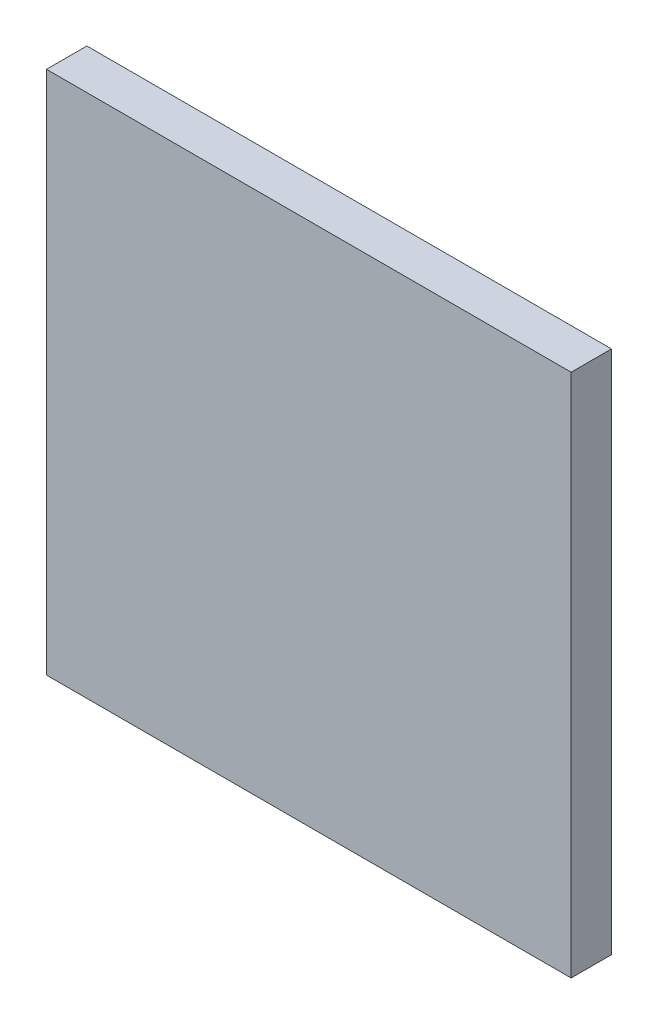
ISO-10303-21;
HEADER;
FILE_DESCRIPTION(('STEP AP214'),'2;1');
FILE_NAME('part.step','',(''),(''),'','','');
FILE_SCHEMA(('AUTOMOTIVE_DESIGN { 1 0 10303 214 1 1 1 1 }'));
ENDSEC;
DATA;
#1=APPLICATION_CONTEXT('core data for automotive mechanical design processes');
#2=APPLICATION_PROTOCOL_DEFINITION('international standard','automotive_design',2000,#1);
#3=PRODUCT_CONTEXT('',#1,'mechanical');
#4=PRODUCT('Part','Part','',(#3));
#5=PRODUCT_RELATED_PRODUCT_CATEGORY('part','',(#4));
#6=PRODUCT_DEFINITION_FORMATION('','',#4);
#7=PRODUCT_DEFINITION_CONTEXT('part definition',#1,'design');
#8=PRODUCT_DEFINITION('design','',#6,#7);
#9=PRODUCT_DEFINITION_SHAPE('','',#8);
#10=(LENGTH_UNIT() NAMED_UNIT(*) SI_UNIT(.MILLI.,.METRE.));
#11=(NAMED_UNIT(*) PLANE_ANGLE_UNIT() SI_UNIT($,.RADIAN.));
#12=(NAMED_UNIT(*) SI_UNIT($,.STERADIAN.) SOLID_ANGLE_UNIT());
#13=UNCERTAINTY_MEASURE_WITH_UNIT(LENGTH_MEASURE(1.E-05),#10,'distance_accuracy_value','');
#14=(GEOMETRIC_REPRESENTATION_CONTEXT(3) GLOBAL_UNCERTAINTY_ASSIGNED_CONTEXT((#13)) GLOBAL_UNIT_ASSIGNED_CONTEXT((#10,
#11,#12)) REPRESENTATION_CONTEXT('',''));
#15=CARTESIAN_POINT('',(0.,0.,0.));
#16=DIRECTION('',(0.,0.,1.));
#17=DIRECTION('',(1.,0.,0.));
#18=AXIS2_PLACEMENT_3D('',#15,#16,#17);
#19=CARTESIAN_POINT('',(32.5,-32.5,5.));
#20=DIRECTION('',(-1.,0.,0.));
#21=DIRECTION('',(0.,0.,1.));
#22=AXIS2_PLACEMENT_3D('',#19,#20,#21);
#23=PLANE('',#22);
#24=DIRECTION('',(0.,1.,0.));
#25=VECTOR('',#24,1.);
#26=CARTESIAN_POINT('',(32.5,-32.5,0.));
#27=LINE('',#26,#25);
#28=CARTESIAN_POINT('',(32.5,-32.5,0.));
#29=VERTEX_POINT('',#28);
#30=CARTESIAN_POINT('',(32.5,32.5,0.));
#31=VERTEX_POINT('',#30);
#32=EDGE_CURVE('E105',#29,#31,#27,.T.);
#33=ORIENTED_EDGE('',*,*,#32,.T.);
#34=DIRECTION('',(0.,0.,-1.));
#35=VECTOR('',#34,1.);
#36=CARTESIAN_POINT('',(32.5,32.5,5.));
#37=LINE('',#36,#35);
#38=CARTESIAN_POINT('',(32.5,32.5,5.));
#39=VERTEX_POINT('',#38);
#40=EDGE_CURVE('E11',#39,#31,#37,.T.);
#41=ORIENTED_EDGE('',*,*,#40,.F.);
#42=DIRECTION('',(0.,1.,0.));
#43=VECTOR('',#42,1.);
#44=CARTESIAN_POINT('',(32.5,-32.5,5.));
#45=LINE('',#44,#43);
#46=CARTESIAN_POINT('',(32.5,-32.5,5.));
#47=VERTEX_POINT('',#46);
#48=EDGE_CURVE('E89',#47,#39,#45,.T.);
#49=ORIENTED_EDGE('',*,*,#48,.F.);
#50=DIRECTION('',(0.,0.,-1.));
#51=VECTOR('',#50,1.);
#52=CARTESIAN_POINT('',(32.5,-32.5,5.));
#53=LINE('',#52,#51);
#54=EDGE_CURVE('E98',#47,#29,#53,.T.);
#55=ORIENTED_EDGE('',*,*,#54,.T.);
#56=EDGE_LOOP('',(#33,#41,#49,#55));
#57=FACE_BOUND('',#56,.T.);
#58=ADVANCED_FACE('F39',(#57),#23,.F.);
#59=CARTESIAN_POINT('',(-32.5,32.5,5.));
#60=DIRECTION('',(0.,-1.,0.));
#61=DIRECTION('',(0.,0.,-1.));
#62=AXIS2_PLACEMENT_3D('',#59,#60,#61);
#63=PLANE('',#62);
#64=DIRECTION('',(-1.,0.,0.));
#65=VECTOR('',#64,1.);
#66=CARTESIAN_POINT('',(-32.5,32.5,0.));
#67=LINE('',#66,#65);
#68=CARTESIAN_POINT('',(-32.5,32.5,0.));
#69=VERTEX_POINT('',#68);
#70=EDGE_CURVE('E94',#31,#69,#67,.T.);
#71=ORIENTED_EDGE('',*,*,#70,.T.);
#72=DIRECTION('',(0.,0.,-1.));
#73=VECTOR('',#72,1.);
#74=CARTESIAN_POINT('',(-32.5,32.5,5.));
#75=LINE('',#74,#73);
#76=CARTESIAN_POINT('',(-32.5,32.5,5.));
#77=VERTEX_POINT('',#76);
#78=EDGE_CURVE('E50',#77,#69,#75,.T.);
#79=ORIENTED_EDGE('',*,*,#78,.F.);
#80=DIRECTION('',(-1.,0.,0.));
#81=VECTOR('',#80,1.);
#82=CARTESIAN_POINT('',(-32.5,32.5,5.));
#83=LINE('',#82,#81);
#84=EDGE_CURVE('E81',#39,#77,#83,.T.);
#85=ORIENTED_EDGE('',*,*,#84,.F.);
#86=ORIENTED_EDGE('',*,*,#40,.T.);
#87=EDGE_LOOP('',(#71,#79,#85,#86));
#88=FACE_BOUND('',#87,.T.);
#89=ADVANCED_FACE('F91',(#88),#63,.F.);
#90=CARTESIAN_POINT('',(-32.5,-32.5,5.));
#91=DIRECTION('',(1.,0.,0.));
#92=DIRECTION('',(0.,0.,-1.));
#93=AXIS2_PLACEMENT_3D('',#90,#91,#92);
#94=PLANE('',#93);
#95=DIRECTION('',(0.,-1.,0.));
#96=VECTOR('',#95,1.);
#97=CARTESIAN_POINT('',(-32.5,-32.5,0.));
#98=LINE('',#97,#96);
#99=CARTESIAN_POINT('',(-32.5,-32.5,0.));
#100=VERTEX_POINT('',#99);
#101=EDGE_CURVE('E75',#69,#100,#98,.T.);
#102=ORIENTED_EDGE('',*,*,#101,.T.);
#103=DIRECTION('',(0.,0.,-1.));
#104=VECTOR('',#103,1.);
#105=CARTESIAN_POINT('',(-32.5,-32.5,5.));
#106=LINE('',#105,#104);
#107=CARTESIAN_POINT('',(-32.5,-32.5,5.));
#108=VERTEX_POINT('',#107);
#109=EDGE_CURVE('E92',#108,#100,#106,.T.);
#110=ORIENTED_EDGE('',*,*,#109,.F.);
#111=DIRECTION('',(0.,-1.,0.));
#112=VECTOR('',#111,1.);
#113=CARTESIAN_POINT('',(-32.5,-32.5,5.));
#114=LINE('',#113,#112);
#115=EDGE_CURVE('E86',#77,#108,#114,.T.);
#116=ORIENTED_EDGE('',*,*,#115,.F.);
#117=ORIENTED_EDGE('',*,*,#78,.T.);
#118=EDGE_LOOP('',(#102,#110,#116,#117));
#119=FACE_BOUND('',#118,.T.);
#120=ADVANCED_FACE('F96',(#119),#94,.F.);
#121=CARTESIAN_POINT('',(-32.5,-32.5,5.));
#122=DIRECTION('',(0.,1.,0.));
#123=DIRECTION('',(-1.,0.,0.));
#124=AXIS2_PLACEMENT_3D('',#121,#122,#123);
#125=PLANE('',#124);
#126=DIRECTION('',(1.,0.,0.));
#127=VECTOR('',#126,1.);
#128=CARTESIAN_POINT('',(-32.5,-32.5,0.));
#129=LINE('',#128,#127);
#130=EDGE_CURVE('E77',#100,#29,#129,.T.);
#131=ORIENTED_EDGE('',*,*,#130,.T.);
#132=ORIENTED_EDGE('',*,*,#54,.F.);
#133=DIRECTION('',(1.,0.,0.));
#134=VECTOR('',#133,1.);
#135=CARTESIAN_POINT('',(-32.5,-32.5,5.));
#136=LINE('',#135,#134);
#137=EDGE_CURVE('E54',#108,#47,#136,.T.);
#138=ORIENTED_EDGE('',*,*,#137,.F.);
#139=ORIENTED_EDGE('',*,*,#109,.T.);
#140=EDGE_LOOP('',(#131,#132,#138,#139));
#141=FACE_BOUND('',#140,.T.);
#142=ADVANCED_FACE('F108',(#141),#125,.F.);
#143=CARTESIAN_POINT('',(0.,0.,5.));
#144=DIRECTION('',(0.,0.,-1.));
#145=DIRECTION('',(-1.,0.,0.));
#146=AXIS2_PLACEMENT_3D('',#143,#144,#145);
#147=PLANE('',#146);
#148=ORIENTED_EDGE('',*,*,#48,.T.);
#149=ORIENTED_EDGE('',*,*,#84,.T.);
#150=ORIENTED_EDGE('',*,*,#115,.T.);
#151=ORIENTED_EDGE('',*,*,#137,.T.);
#152=EDGE_LOOP('',(#148,#149,#150,#151));
#153=FACE_BOUND('',#152,.T.);
#154=ADVANCED_FACE('F88',(#153),#147,.F.);
#155=CARTESIAN_POINT('',(0.,0.,0.));
#156=DIRECTION('',(0.,0.,-1.));
#157=DIRECTION('',(-1.,0.,0.));
#158=AXIS2_PLACEMENT_3D('',#155,#156,#157);
#159=PLANE('',#158);
#160=ORIENTED_EDGE('',*,*,#32,.F.);
#161=ORIENTED_EDGE('',*,*,#130,.F.);
#162=ORIENTED_EDGE('',*,*,#101,.F.);
#163=ORIENTED_EDGE('',*,*,#70,.F.);
#164=EDGE_LOOP('',(#160,#161,#162,#163));
#165=FACE_BOUND('',#164,.T.);
#166=ADVANCED_FACE('F115',(#165),#159,.T.);
#167=CLOSED_SHELL('',(#58,#89,#120,#142,#154,#166));
#168=MANIFOLD_SOLID_BREP('B2',#167);
#169=ADVANCED_BREP_SHAPE_REPRESENTATION('',(#18,#168),#14);
#170=SHAPE_DEFINITION_REPRESENTATION(#9,#169);
ENDSEC;
END-ISO-10303-21;
